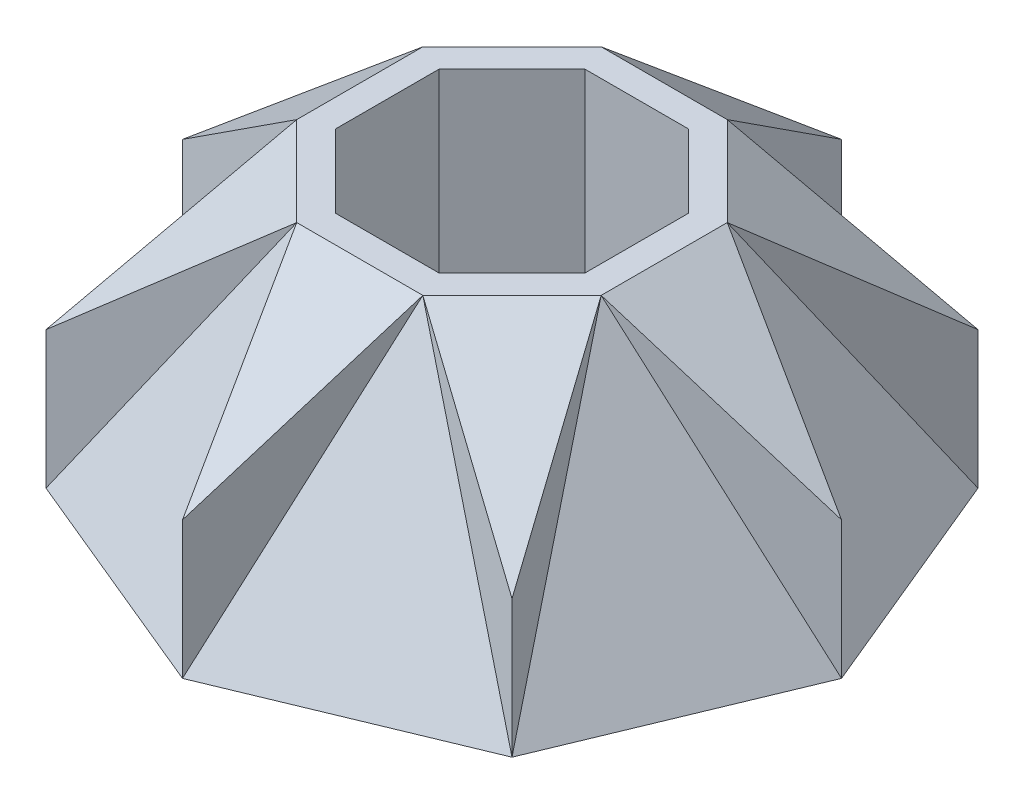
ISO-10303-21;
HEADER;
FILE_DESCRIPTION(('STEP AP214'),'2;1');
FILE_NAME('part.step','',(''),(''),'','','');
FILE_SCHEMA(('AUTOMOTIVE_DESIGN { 1 0 10303 214 1 1 1 1 }'));
ENDSEC;
DATA;
#1=APPLICATION_CONTEXT('core data for automotive mechanical design processes');
#2=APPLICATION_PROTOCOL_DEFINITION('international standard','automotive_design',2000,#1);
#3=PRODUCT_CONTEXT('',#1,'mechanical');
#4=PRODUCT('Part','Part','',(#3));
#5=PRODUCT_RELATED_PRODUCT_CATEGORY('part','',(#4));
#6=PRODUCT_DEFINITION_FORMATION('','',#4);
#7=PRODUCT_DEFINITION_CONTEXT('part definition',#1,'design');
#8=PRODUCT_DEFINITION('design','',#6,#7);
#9=PRODUCT_DEFINITION_SHAPE('','',#8);
#10=(LENGTH_UNIT() NAMED_UNIT(*) SI_UNIT(.MILLI.,.METRE.));
#11=(NAMED_UNIT(*) PLANE_ANGLE_UNIT() SI_UNIT($,.RADIAN.));
#12=(NAMED_UNIT(*) SI_UNIT($,.STERADIAN.) SOLID_ANGLE_UNIT());
#13=UNCERTAINTY_MEASURE_WITH_UNIT(LENGTH_MEASURE(1.E-05),#10,'distance_accuracy_value','');
#14=(GEOMETRIC_REPRESENTATION_CONTEXT(3) GLOBAL_UNCERTAINTY_ASSIGNED_CONTEXT((#13)) GLOBAL_UNIT_ASSIGNED_CONTEXT((#10,
#11,#12)) REPRESENTATION_CONTEXT('',''));
#15=CARTESIAN_POINT('',(0.,0.,0.));
#16=DIRECTION('',(0.,0.,1.));
#17=DIRECTION('',(1.,0.,0.));
#18=AXIS2_PLACEMENT_3D('',#15,#16,#17);
#19=CARTESIAN_POINT('',(-11.4805029709529,50.,27.7163859753386));
#20=DIRECTION('',(0.942197327088307,0.,-0.335058497620415));
#21=DIRECTION('',(-0.335058497620415,0.,-0.942197327088307));
#22=AXIS2_PLACEMENT_3D('',#19,#20,#21);
#23=PLANE('',#22);
#24=DIRECTION('',(0.270670713638564,-0.58941388352804,0.761136412663843));
#25=VECTOR('',#24,1.);
#26=CARTESIAN_POINT('',(-4.39583137593275,34.5723841260576,47.6387538231425));
#27=LINE('',#26,#25);
#28=CARTESIAN_POINT('',(-11.4805029709529,50.,27.7163859753386));
#29=VERTEX_POINT('',#28);
#30=CARTESIAN_POINT('',(-7.85181403525059E-13,25.,60.0000000000001));
#31=VERTEX_POINT('',#30);
#32=EDGE_CURVE('E57',#29,#31,#27,.T.);
#33=ORIENTED_EDGE('',*,*,#32,.F.);
#34=DIRECTION('',(-0.189404088078929,0.824894556267091,-0.532611549311417));
#35=VECTOR('',#34,1.);
#36=CARTESIAN_POINT('',(-6.05272828785892,26.3609020579179,42.9794962524054));
#37=LINE('',#36,#35);
#38=CARTESIAN_POINT('',(-7.85181403525059E-13,0.,60.0000000000001));
#39=VERTEX_POINT('',#38);
#40=EDGE_CURVE('E342',#39,#29,#37,.T.);
#41=ORIENTED_EDGE('',*,*,#40,.F.);
#42=DIRECTION('',(0.,-1.,0.));
#43=VECTOR('',#42,1.);
#44=CARTESIAN_POINT('',(-7.85181403525059E-13,50.,60.0000000000001));
#45=LINE('',#44,#43);
#46=EDGE_CURVE('E335',#31,#39,#45,.T.);
#47=ORIENTED_EDGE('',*,*,#46,.F.);
#48=EDGE_LOOP('',(#33,#41,#47));
#49=FACE_BOUND('',#48,.T.);
#50=ADVANCED_FACE('F41',(#49),#23,.F.);
#51=CARTESIAN_POINT('',(-7.85181403525059E-13,50.,60.0000000000001));
#52=DIRECTION('',(-0.942197327088295,0.,-0.335058497620448));
#53=DIRECTION('',(-0.335058497620448,0.,0.942197327088295));
#54=AXIS2_PLACEMENT_3D('',#51,#52,#53);
#55=PLANE('',#54);
#56=DIRECTION('',(-0.270670713638591,-0.589413883528038,0.761136412663835));
#57=VECTOR('',#56,1.);
#58=CARTESIAN_POINT('',(4.39583137593183,34.572384126058,47.638753823142));
#59=LINE('',#58,#57);
#60=CARTESIAN_POINT('',(11.4805029709527,50.,27.7163859753386));
#61=VERTEX_POINT('',#60);
#62=EDGE_CURVE('E281',#61,#31,#59,.T.);
#63=ORIENTED_EDGE('',*,*,#62,.T.);
#64=ORIENTED_EDGE('',*,*,#46,.T.);
#65=DIRECTION('',(-0.18940408807895,-0.824894556267086,0.532611549311418));
#66=VECTOR('',#65,1.);
#67=CARTESIAN_POINT('',(6.05272828785801,26.3609020579182,42.9794962524054));
#68=LINE('',#67,#66);
#69=EDGE_CURVE('E338',#61,#39,#68,.T.);
#70=ORIENTED_EDGE('',*,*,#69,.F.);
#71=EDGE_LOOP('',(#63,#64,#70));
#72=FACE_BOUND('',#71,.T.);
#73=ADVANCED_FACE('F493',(#72),#55,.F.);
#74=CARTESIAN_POINT('',(27.7163859753387,50.,11.4805029709526));
#75=DIRECTION('',(-0.335058497620425,0.,-0.942197327088304));
#76=DIRECTION('',(-0.942197327088304,0.,0.335058497620425));
#77=AXIS2_PLACEMENT_3D('',#74,#75,#76);
#78=PLANE('',#77);
#79=DIRECTION('',(0.761136412663841,-0.58941388352804,-0.270670713638572));
#80=VECTOR('',#79,1.);
#81=CARTESIAN_POINT('',(47.6387538231426,34.5723841260575,4.3958313759322));
#82=LINE('',#81,#80);
#83=CARTESIAN_POINT('',(27.7163859753386,50.,11.4805029709528));
#84=VERTEX_POINT('',#83);
#85=CARTESIAN_POINT('',(60.0000000000001,25.,1.56714762533294E-13));
#86=VERTEX_POINT('',#85);
#87=EDGE_CURVE('E65',#84,#86,#82,.T.);
#88=ORIENTED_EDGE('',*,*,#87,.F.);
#89=DIRECTION('',(-0.532611549311422,0.824894556267086,0.189404088078937));
#90=VECTOR('',#89,1.);
#91=CARTESIAN_POINT('',(42.9794962524054,26.3609020579183,6.05272828785848));
#92=LINE('',#91,#90);
#93=CARTESIAN_POINT('',(60.0000000000001,0.,1.56714762533294E-13));
#94=VERTEX_POINT('',#93);
#95=EDGE_CURVE('E50',#94,#84,#92,.T.);
#96=ORIENTED_EDGE('',*,*,#95,.F.);
#97=DIRECTION('',(0.,-1.,0.));
#98=VECTOR('',#97,1.);
#99=CARTESIAN_POINT('',(60.0000000000001,50.,1.56714762533294E-13));
#100=LINE('',#99,#98);
#101=EDGE_CURVE('E353',#86,#94,#100,.T.);
#102=ORIENTED_EDGE('',*,*,#101,.F.);
#103=EDGE_LOOP('',(#88,#96,#102));
#104=FACE_BOUND('',#103,.T.);
#105=ADVANCED_FACE('F516',(#104),#78,.F.);
#106=CARTESIAN_POINT('',(60.0000000000001,50.,1.56714762533294E-13));
#107=DIRECTION('',(-0.335058497620438,0.,0.942197327088299));
#108=DIRECTION('',(0.942197327088299,0.,0.335058497620438));
#109=AXIS2_PLACEMENT_3D('',#106,#107,#108);
#110=PLANE('',#109);
#111=DIRECTION('',(0.761136412663838,-0.589413883528038,0.270670713638583));
#112=VECTOR('',#111,1.);
#113=CARTESIAN_POINT('',(47.6387538231421,34.5723841260579,-4.39583137593227));
#114=LINE('',#113,#112);
#115=CARTESIAN_POINT('',(27.7163859753386,50.,-11.4805029709528));
#116=VERTEX_POINT('',#115);
#117=EDGE_CURVE('E286',#116,#86,#114,.T.);
#118=ORIENTED_EDGE('',*,*,#117,.T.);
#119=ORIENTED_EDGE('',*,*,#101,.T.);
#120=DIRECTION('',(0.532611549311418,-0.824894556267088,0.189404088078944));
#121=VECTOR('',#120,1.);
#122=CARTESIAN_POINT('',(42.9794962524054,26.360902057918,-6.05272828785846));
#123=LINE('',#122,#121);
#124=EDGE_CURVE('E356',#116,#94,#123,.T.);
#125=ORIENTED_EDGE('',*,*,#124,.F.);
#126=EDGE_LOOP('',(#118,#119,#125));
#127=FACE_BOUND('',#126,.T.);
#128=ADVANCED_FACE('F515',(#127),#110,.F.);
#129=CARTESIAN_POINT('',(11.4805029709527,50.,-27.7163859753387));
#130=DIRECTION('',(-0.942197327088305,0.,0.335058497620422));
#131=DIRECTION('',(0.335058497620422,0.,0.942197327088305));
#132=AXIS2_PLACEMENT_3D('',#129,#130,#131);
#133=PLANE('',#132);
#134=DIRECTION('',(-0.270670713638569,-0.58941388352804,-0.761136412663842));
#135=VECTOR('',#134,1.);
#136=CARTESIAN_POINT('',(4.39583137593238,34.5723841260575,-47.6387538231426));
#137=LINE('',#136,#135);
#138=CARTESIAN_POINT('',(11.4805029709527,50.,-27.7163859753386));
#139=VERTEX_POINT('',#138);
#140=CARTESIAN_POINT('',(3.66203642863882E-13,25.,-60.0000000000001));
#141=VERTEX_POINT('',#140);
#142=EDGE_CURVE('E289',#139,#141,#137,.T.);
#143=ORIENTED_EDGE('',*,*,#142,.F.);
#144=DIRECTION('',(0.189404088078933,0.82489455626709,0.532611549311418));
#145=VECTOR('',#144,1.);
#146=CARTESIAN_POINT('',(6.05272828785862,26.360902057918,-42.9794962524054));
#147=LINE('',#146,#145);
#148=CARTESIAN_POINT('',(3.66203642863882E-13,0.,-60.0000000000001));
#149=VERTEX_POINT('',#148);
#150=EDGE_CURVE('E467',#149,#139,#147,.T.);
#151=ORIENTED_EDGE('',*,*,#150,.F.);
#152=DIRECTION('',(0.,-1.,0.));
#153=VECTOR('',#152,1.);
#154=CARTESIAN_POINT('',(3.66203642863882E-13,50.,-60.0000000000001));
#155=LINE('',#154,#153);
#156=EDGE_CURVE('E367',#141,#149,#155,.T.);
#157=ORIENTED_EDGE('',*,*,#156,.F.);
#158=EDGE_LOOP('',(#143,#151,#157));
#159=FACE_BOUND('',#158,.T.);
#160=ADVANCED_FACE('F523',(#159),#133,.F.);
#161=CARTESIAN_POINT('',(3.66203642863882E-13,50.,-60.0000000000001));
#162=DIRECTION('',(0.942197327088298,0.,0.335058497620442));
#163=DIRECTION('',(0.335058497620442,0.,-0.942197327088298));
#164=AXIS2_PLACEMENT_3D('',#161,#162,#163);
#165=PLANE('',#164);
#166=DIRECTION('',(0.270670713638586,-0.589413883528038,-0.761136412663837));
#167=VECTOR('',#166,1.);
#168=CARTESIAN_POINT('',(-4.39583137593214,34.5723841260579,-47.6387538231421));
#169=LINE('',#168,#167);
#170=CARTESIAN_POINT('',(-11.4805029709527,50.,-27.7163859753386));
#171=VERTEX_POINT('',#170);
#172=EDGE_CURVE('E292',#171,#141,#169,.T.);
#173=ORIENTED_EDGE('',*,*,#172,.T.);
#174=ORIENTED_EDGE('',*,*,#156,.T.);
#175=DIRECTION('',(0.189404088078946,-0.824894556267086,-0.532611549311419));
#176=VECTOR('',#175,1.);
#177=CARTESIAN_POINT('',(-6.05272828785831,26.3609020579182,-42.9794962524054));
#178=LINE('',#177,#176);
#179=EDGE_CURVE('E370',#171,#149,#178,.T.);
#180=ORIENTED_EDGE('',*,*,#179,.F.);
#181=EDGE_LOOP('',(#173,#174,#180));
#182=FACE_BOUND('',#181,.T.);
#183=ADVANCED_FACE('F805',(#182),#165,.F.);
#184=CARTESIAN_POINT('',(-11.4805029709528,50.,-27.7163859753386));
#185=DIRECTION('',(-0.429311983438402,0.,0.903156254961557));
#186=DIRECTION('',(0.903156254961557,0.,0.429311983438402));
#187=AXIS2_PLACEMENT_3D('',#184,#185,#186);
#188=PLANE('',#187);
#189=DIRECTION('',(-0.72959781588504,-0.58941388352804,-0.346811621720169));
#190=VECTOR('',#189,1.);
#191=CARTESIAN_POINT('',(-25.6693293184032,38.5373954553154,-34.4609920702677));
#192=LINE('',#191,#190);
#193=CARTESIAN_POINT('',(-42.4264068711927,25.,-42.4264068711931));
#194=VERTEX_POINT('',#193);
#195=EDGE_CURVE('E304',#171,#194,#192,.T.);
#196=ORIENTED_EDGE('',*,*,#195,.F.);
#197=DIRECTION('',(0.510542153321447,0.824894556267088,0.242684323191309));
#198=VECTOR('',#197,1.);
#199=CARTESIAN_POINT('',(-26.1111680350332,26.3609020579182,-34.6710184690821));
#200=LINE('',#199,#198);
#201=CARTESIAN_POINT('',(-42.4264068711927,0.,-42.4264068711931));
#202=VERTEX_POINT('',#201);
#203=EDGE_CURVE('E463',#202,#171,#200,.T.);
#204=ORIENTED_EDGE('',*,*,#203,.F.);
#205=DIRECTION('',(0.,-1.,0.));
#206=VECTOR('',#205,1.);
#207=CARTESIAN_POINT('',(-42.4264068711927,50.,-42.4264068711931));
#208=LINE('',#207,#206);
#209=EDGE_CURVE('E374',#194,#202,#208,.T.);
#210=ORIENTED_EDGE('',*,*,#209,.F.);
#211=EDGE_LOOP('',(#196,#204,#210));
#212=FACE_BOUND('',#211,.T.);
#213=ADVANCED_FACE('F795',(#212),#188,.F.);
#214=CARTESIAN_POINT('',(-42.4264068711927,50.,-42.4264068711931));
#215=DIRECTION('',(0.903156254961565,0.,-0.429311983438385));
#216=DIRECTION('',(-0.429311983438385,0.,-0.903156254961565));
#217=AXIS2_PLACEMENT_3D('',#214,#215,#216);
#218=PLANE('',#217);
#219=DIRECTION('',(-0.346811621720157,-0.589413883528038,-0.729597815885047));
#220=VECTOR('',#219,1.);
#221=CARTESIAN_POINT('',(-34.4609920702672,38.537395455316,-25.6693293184027));
#222=LINE('',#221,#220);
#223=CARTESIAN_POINT('',(-27.7163859753387,50.,-11.4805029709526));
#224=VERTEX_POINT('',#223);
#225=EDGE_CURVE('E307',#224,#194,#222,.T.);
#226=ORIENTED_EDGE('',*,*,#225,.T.);
#227=ORIENTED_EDGE('',*,*,#209,.T.);
#228=DIRECTION('',(-0.242684323191301,-0.824894556267086,-0.510542153321455));
#229=VECTOR('',#228,1.);
#230=CARTESIAN_POINT('',(-34.671018469082,26.3609020579182,-26.1111680350333));
#231=LINE('',#230,#229);
#232=EDGE_CURVE('E377',#224,#202,#231,.T.);
#233=ORIENTED_EDGE('',*,*,#232,.F.);
#234=EDGE_LOOP('',(#226,#227,#233));
#235=FACE_BOUND('',#234,.T.);
#236=ADVANCED_FACE('F785',(#235),#218,.F.);
#237=CARTESIAN_POINT('',(27.7163859753387,50.,-11.4805029709527));
#238=DIRECTION('',(-0.903156254961556,0.,-0.429311983438405));
#239=DIRECTION('',(-0.429311983438405,0.,0.903156254961556));
#240=AXIS2_PLACEMENT_3D('',#237,#238,#239);
#241=PLANE('',#240);
#242=DIRECTION('',(0.346811621720172,-0.58941388352804,-0.729597815885038));
#243=VECTOR('',#242,1.);
#244=CARTESIAN_POINT('',(34.4609920702677,38.5373954553154,-25.6693293184031));
#245=LINE('',#244,#243);
#246=CARTESIAN_POINT('',(42.4264068711932,25.,-42.4264068711926));
#247=VERTEX_POINT('',#246);
#248=EDGE_CURVE('E313',#116,#247,#245,.T.);
#249=ORIENTED_EDGE('',*,*,#248,.F.);
#250=DIRECTION('',(-0.242684323191311,0.824894556267088,0.510542153321446));
#251=VECTOR('',#250,1.);
#252=CARTESIAN_POINT('',(34.6710184690822,26.3609020579182,-26.1111680350331));
#253=LINE('',#252,#251);
#254=CARTESIAN_POINT('',(42.4264068711932,0.,-42.4264068711926));
#255=VERTEX_POINT('',#254);
#256=EDGE_CURVE('E471',#255,#116,#253,.T.);
#257=ORIENTED_EDGE('',*,*,#256,.F.);
#258=DIRECTION('',(0.,-1.,0.));
#259=VECTOR('',#258,1.);
#260=CARTESIAN_POINT('',(42.4264068711932,50.,-42.4264068711926));
#261=LINE('',#260,#259);
#262=EDGE_CURVE('E360',#247,#255,#261,.T.);
#263=ORIENTED_EDGE('',*,*,#262,.F.);
#264=EDGE_LOOP('',(#249,#257,#263));
#265=FACE_BOUND('',#264,.T.);
#266=ADVANCED_FACE('F775',(#265),#241,.F.);
#267=CARTESIAN_POINT('',(42.4264068711932,50.,-42.4264068711926));
#268=DIRECTION('',(0.429311983438382,0.,0.903156254961567));
#269=DIRECTION('',(0.903156254961567,0.,-0.429311983438382));
#270=AXIS2_PLACEMENT_3D('',#267,#268,#269);
#271=PLANE('',#270);
#272=DIRECTION('',(0.729597815885048,-0.589413883528038,-0.346811621720154));
#273=VECTOR('',#272,1.);
#274=CARTESIAN_POINT('',(25.6693293184028,38.537395455316,-34.4609920702671));
#275=LINE('',#274,#273);
#276=EDGE_CURVE('E308',#139,#247,#275,.T.);
#277=ORIENTED_EDGE('',*,*,#276,.T.);
#278=ORIENTED_EDGE('',*,*,#262,.T.);
#279=DIRECTION('',(0.510542153321458,-0.824894556267084,-0.242684323191301));
#280=VECTOR('',#279,1.);
#281=CARTESIAN_POINT('',(26.1111680350335,26.3609020579183,-34.6710184690819));
#282=LINE('',#281,#280);
#283=EDGE_CURVE('E363',#139,#255,#282,.T.);
#284=ORIENTED_EDGE('',*,*,#283,.F.);
#285=EDGE_LOOP('',(#277,#278,#284));
#286=FACE_BOUND('',#285,.T.);
#287=ADVANCED_FACE('F538',(#286),#271,.F.);
#288=CARTESIAN_POINT('',(11.4805029709526,50.,27.7163859753387));
#289=DIRECTION('',(0.429311983438408,0.,-0.903156254961554));
#290=DIRECTION('',(-0.903156254961554,0.,-0.429311983438408));
#291=AXIS2_PLACEMENT_3D('',#288,#289,#290);
#292=PLANE('',#291);
#293=DIRECTION('',(0.729597815885037,-0.58941388352804,0.346811621720174));
#294=VECTOR('',#293,1.);
#295=CARTESIAN_POINT('',(25.669329318403,38.5373954553154,34.4609920702678));
#296=LINE('',#295,#294);
#297=CARTESIAN_POINT('',(42.4264068711924,25.,42.4264068711934));
#298=VERTEX_POINT('',#297);
#299=EDGE_CURVE('E303',#61,#298,#296,.T.);
#300=ORIENTED_EDGE('',*,*,#299,.F.);
#301=DIRECTION('',(-0.510542153321445,0.824894556267088,-0.242684323191313));
#302=VECTOR('',#301,1.);
#303=CARTESIAN_POINT('',(26.111168035033,26.3609020579182,34.6710184690823));
#304=LINE('',#303,#302);
#305=CARTESIAN_POINT('',(42.4264068711924,0.,42.4264068711934));
#306=VERTEX_POINT('',#305);
#307=EDGE_CURVE('E11',#306,#61,#304,.T.);
#308=ORIENTED_EDGE('',*,*,#307,.F.);
#309=DIRECTION('',(0.,-1.,0.));
#310=VECTOR('',#309,1.);
#311=CARTESIAN_POINT('',(42.4264068711924,50.,42.4264068711934));
#312=LINE('',#311,#310);
#313=EDGE_CURVE('E346',#298,#306,#312,.T.);
#314=ORIENTED_EDGE('',*,*,#313,.F.);
#315=EDGE_LOOP('',(#300,#308,#314));
#316=FACE_BOUND('',#315,.T.);
#317=ADVANCED_FACE('F535',(#316),#292,.F.);
#318=CARTESIAN_POINT('',(42.4264068711924,50.,42.4264068711934));
#319=DIRECTION('',(-0.903156254961568,0.,0.429311983438379));
#320=DIRECTION('',(0.429311983438379,0.,0.903156254961568));
#321=AXIS2_PLACEMENT_3D('',#318,#319,#320);
#322=PLANE('',#321);
#323=DIRECTION('',(0.346811621720151,-0.589413883528038,0.72959781588505));
#324=VECTOR('',#323,1.);
#325=CARTESIAN_POINT('',(34.460992070267,38.537395455316,25.6693293184029));
#326=LINE('',#325,#324);
#327=EDGE_CURVE('E316',#84,#298,#326,.T.);
#328=ORIENTED_EDGE('',*,*,#327,.T.);
#329=ORIENTED_EDGE('',*,*,#313,.T.);
#330=DIRECTION('',(0.242684323191298,-0.824894556267086,0.510542153321456));
#331=VECTOR('',#330,1.);
#332=CARTESIAN_POINT('',(34.6710184690818,26.3609020579182,26.1111680350336));
#333=LINE('',#332,#331);
#334=EDGE_CURVE('E349',#84,#306,#333,.T.);
#335=ORIENTED_EDGE('',*,*,#334,.F.);
#336=EDGE_LOOP('',(#328,#329,#335));
#337=FACE_BOUND('',#336,.T.);
#338=ADVANCED_FACE('F537',(#337),#322,.F.);
#339=CARTESIAN_POINT('',(-27.7163859753387,50.,11.4805029709525));
#340=DIRECTION('',(0.903156254961553,0.,0.429311983438411));
#341=DIRECTION('',(0.429311983438411,0.,-0.903156254961553));
#342=AXIS2_PLACEMENT_3D('',#339,#340,#341);
#343=PLANE('',#342);
#344=DIRECTION('',(-0.346811621720177,-0.58941388352804,0.729597815885036));
#345=VECTOR('',#344,1.);
#346=CARTESIAN_POINT('',(-34.4609920702679,38.5373954553154,25.6693293184029));
#347=LINE('',#346,#345);
#348=CARTESIAN_POINT('',(-27.7163859753387,50.,11.4805029709525));
#349=VERTEX_POINT('',#348);
#350=CARTESIAN_POINT('',(-42.4264068711935,25.,42.4264068711923));
#351=VERTEX_POINT('',#350);
#352=EDGE_CURVE('E296',#349,#351,#347,.T.);
#353=ORIENTED_EDGE('',*,*,#352,.F.);
#354=DIRECTION('',(0.242684323191312,0.824894556267091,-0.51054215332144));
#355=VECTOR('',#354,1.);
#356=CARTESIAN_POINT('',(-34.6710184690824,26.3609020579179,26.1111680350329));
#357=LINE('',#356,#355);
#358=CARTESIAN_POINT('',(-42.4264068711935,0.,42.4264068711923));
#359=VERTEX_POINT('',#358);
#360=EDGE_CURVE('E331',#359,#349,#357,.T.);
#361=ORIENTED_EDGE('',*,*,#360,.F.);
#362=DIRECTION('',(0.,-1.,0.));
#363=VECTOR('',#362,1.);
#364=CARTESIAN_POINT('',(-42.4264068711935,50.,42.4264068711923));
#365=LINE('',#364,#363);
#366=EDGE_CURVE('E312',#351,#359,#365,.T.);
#367=ORIENTED_EDGE('',*,*,#366,.F.);
#368=EDGE_LOOP('',(#353,#361,#367));
#369=FACE_BOUND('',#368,.T.);
#370=ADVANCED_FACE('F541',(#369),#343,.F.);
#371=CARTESIAN_POINT('',(-42.4264068711935,50.,42.4264068711923));
#372=DIRECTION('',(-0.429311983438376,0.,-0.90315625496157));
#373=DIRECTION('',(-0.90315625496157,0.,0.429311983438376));
#374=AXIS2_PLACEMENT_3D('',#371,#372,#373);
#375=PLANE('',#374);
#376=DIRECTION('',(-0.729597815885051,-0.589413883528038,0.346811621720149));
#377=VECTOR('',#376,1.);
#378=CARTESIAN_POINT('',(-25.669329318403,38.537395455316,34.4609920702669));
#379=LINE('',#378,#377);
#380=EDGE_CURVE('E299',#29,#351,#379,.T.);
#381=ORIENTED_EDGE('',*,*,#380,.T.);
#382=ORIENTED_EDGE('',*,*,#366,.T.);
#383=DIRECTION('',(-0.510542153321461,-0.824894556267083,0.242684323191298));
#384=VECTOR('',#383,1.);
#385=CARTESIAN_POINT('',(-26.1111680350337,26.3609020579185,34.6710184690817));
#386=LINE('',#385,#384);
#387=EDGE_CURVE('E327',#29,#359,#386,.T.);
#388=ORIENTED_EDGE('',*,*,#387,.F.);
#389=EDGE_LOOP('',(#381,#382,#388));
#390=FACE_BOUND('',#389,.T.);
#391=ADVANCED_FACE('F532',(#390),#375,.F.);
#392=CARTESIAN_POINT('',(-16.8528575962111,22.4004933431644,40.6863973735154));
#393=DIRECTION('',(-0.341093393395736,0.453374761196364,0.823472296371847));
#394=DIRECTION('',(0.,-0.876006947372515,0.482298484504242));
#395=AXIS2_PLACEMENT_3D('',#392,#393,#394);
#396=PLANE('',#395);
#397=ORIENTED_EDGE('',*,*,#40,.T.);
#398=ORIENTED_EDGE('',*,*,#387,.T.);
#399=DIRECTION('',(0.923879532511287,0.,0.38268343236509));
#400=VECTOR('',#399,1.);
#401=CARTESIAN_POINT('',(-21.2132034355964,0.,51.2132034355964));
#402=LINE('',#401,#400);
#403=EDGE_CURVE('E429',#359,#39,#402,.T.);
#404=ORIENTED_EDGE('',*,*,#403,.T.);
#405=EDGE_LOOP('',(#397,#398,#404));
#406=FACE_BOUND('',#405,.T.);
#407=ADVANCED_FACE('F503',(#406),#396,.T.);
#408=CARTESIAN_POINT('',(-40.6863973735154,22.4004933431644,16.8528575962111));
#409=DIRECTION('',(-0.823472296371847,0.453374761196364,0.341093393395734));
#410=DIRECTION('',(-0.341036528948945,-0.876006947372515,0.341036528948944));
#411=AXIS2_PLACEMENT_3D('',#408,#409,#410);
#412=PLANE('',#411);
#413=DIRECTION('',(0.38268343236509,0.,0.923879532511287));
#414=VECTOR('',#413,1.);
#415=CARTESIAN_POINT('',(-51.2132034355964,0.,21.2132034355964));
#416=LINE('',#415,#414);
#417=CARTESIAN_POINT('',(-60.0000000000001,0.,-1.56714762533294E-13));
#418=VERTEX_POINT('',#417);
#419=EDGE_CURVE('E391',#418,#359,#416,.T.);
#420=ORIENTED_EDGE('',*,*,#419,.T.);
#421=ORIENTED_EDGE('',*,*,#360,.T.);
#422=DIRECTION('',(-0.53261154931142,-0.824894556267086,-0.189404088078945));
#423=VECTOR('',#422,1.);
#424=CARTESIAN_POINT('',(-42.9794962524054,26.3609020579182,6.05272828785846));
#425=LINE('',#424,#423);
#426=EDGE_CURVE('E425',#349,#418,#425,.T.);
#427=ORIENTED_EDGE('',*,*,#426,.T.);
#428=EDGE_LOOP('',(#420,#421,#427));
#429=FACE_BOUND('',#428,.T.);
#430=ADVANCED_FACE('F740',(#429),#412,.T.);
#431=CARTESIAN_POINT('',(16.8528575962106,22.4004933431644,40.6863973735156));
#432=DIRECTION('',(0.341093393395726,0.453374761196364,0.823472296371851));
#433=DIRECTION('',(0.34103652894894,-0.876006947372515,0.341036528948948));
#434=AXIS2_PLACEMENT_3D('',#431,#432,#433);
#435=PLANE('',#434);
#436=ORIENTED_EDGE('',*,*,#307,.T.);
#437=ORIENTED_EDGE('',*,*,#69,.T.);
#438=DIRECTION('',(0.923879532511287,0.,-0.38268343236509));
#439=VECTOR('',#438,1.);
#440=CARTESIAN_POINT('',(21.2132034355964,0.,51.2132034355964));
#441=LINE('',#440,#439);
#442=EDGE_CURVE('E433',#39,#306,#441,.T.);
#443=ORIENTED_EDGE('',*,*,#442,.T.);
#444=EDGE_LOOP('',(#436,#437,#443));
#445=FACE_BOUND('',#444,.T.);
#446=ADVANCED_FACE('F499',(#445),#435,.T.);
#447=CARTESIAN_POINT('',(40.6863973735152,22.4004933431644,16.8528575962116));
#448=DIRECTION('',(0.823472296371843,0.453374761196364,0.341093393395744));
#449=DIRECTION('',(0.482298484504242,-0.876006947372515,0.));
#450=AXIS2_PLACEMENT_3D('',#447,#448,#449);
#451=PLANE('',#450);
#452=ORIENTED_EDGE('',*,*,#95,.T.);
#453=ORIENTED_EDGE('',*,*,#334,.T.);
#454=DIRECTION('',(0.38268343236509,0.,-0.923879532511287));
#455=VECTOR('',#454,1.);
#456=CARTESIAN_POINT('',(51.2132034355964,0.,21.2132034355964));
#457=LINE('',#456,#455);
#458=EDGE_CURVE('E437',#306,#94,#457,.T.);
#459=ORIENTED_EDGE('',*,*,#458,.T.);
#460=EDGE_LOOP('',(#452,#453,#459));
#461=FACE_BOUND('',#460,.T.);
#462=ADVANCED_FACE('F478',(#461),#451,.T.);
#463=CARTESIAN_POINT('',(40.6863973735155,22.4004933431644,-16.8528575962108));
#464=DIRECTION('',(0.82347229637185,0.453374761196364,-0.341093393395729));
#465=DIRECTION('',(0.341036528948947,-0.876006947372515,-0.341036528948941));
#466=AXIS2_PLACEMENT_3D('',#463,#464,#465);
#467=PLANE('',#466);
#468=ORIENTED_EDGE('',*,*,#256,.T.);
#469=ORIENTED_EDGE('',*,*,#124,.T.);
#470=DIRECTION('',(-0.38268343236509,0.,-0.923879532511287));
#471=VECTOR('',#470,1.);
#472=CARTESIAN_POINT('',(51.2132034355964,0.,-21.2132034355964));
#473=LINE('',#472,#471);
#474=EDGE_CURVE('E441',#94,#255,#473,.T.);
#475=ORIENTED_EDGE('',*,*,#474,.T.);
#476=EDGE_LOOP('',(#468,#469,#475));
#477=FACE_BOUND('',#476,.T.);
#478=ADVANCED_FACE('F511',(#477),#467,.T.);
#479=CARTESIAN_POINT('',(16.8528575962111,22.4004933431644,-40.6863973735154));
#480=DIRECTION('',(0.341093393395736,0.453374761196364,-0.823472296371847));
#481=DIRECTION('',(0.,-0.876006947372515,-0.482298484504242));
#482=AXIS2_PLACEMENT_3D('',#479,#480,#481);
#483=PLANE('',#482);
#484=ORIENTED_EDGE('',*,*,#150,.T.);
#485=ORIENTED_EDGE('',*,*,#283,.T.);
#486=DIRECTION('',(-0.923879532511287,0.,-0.38268343236509));
#487=VECTOR('',#486,1.);
#488=CARTESIAN_POINT('',(21.2132034355964,0.,-51.2132034355965));
#489=LINE('',#488,#487);
#490=EDGE_CURVE('E445',#255,#149,#489,.T.);
#491=ORIENTED_EDGE('',*,*,#490,.T.);
#492=EDGE_LOOP('',(#484,#485,#491));
#493=FACE_BOUND('',#492,.T.);
#494=ADVANCED_FACE('F712',(#493),#483,.T.);
#495=CARTESIAN_POINT('',(-16.8528575962109,22.4004933431644,-40.6863973735154));
#496=DIRECTION('',(-0.341093393395731,0.453374761196364,-0.823472296371848));
#497=DIRECTION('',(-0.341036528948943,-0.876006947372515,-0.341036528948946));
#498=AXIS2_PLACEMENT_3D('',#495,#496,#497);
#499=PLANE('',#498);
#500=ORIENTED_EDGE('',*,*,#203,.T.);
#501=ORIENTED_EDGE('',*,*,#179,.T.);
#502=DIRECTION('',(-0.923879532511287,0.,0.38268343236509));
#503=VECTOR('',#502,1.);
#504=CARTESIAN_POINT('',(-21.2132034355964,0.,-51.2132034355964));
#505=LINE('',#504,#503);
#506=EDGE_CURVE('E449',#149,#202,#505,.T.);
#507=ORIENTED_EDGE('',*,*,#506,.T.);
#508=EDGE_LOOP('',(#500,#501,#507));
#509=FACE_BOUND('',#508,.T.);
#510=ADVANCED_FACE('F704',(#509),#499,.T.);
#511=CARTESIAN_POINT('',(-40.6863973735153,22.4004933431644,-16.8528575962113));
#512=DIRECTION('',(-0.823472296371845,0.453374761196364,-0.341093393395739));
#513=DIRECTION('',(-0.482298484504242,-0.876006947372515,0.));
#514=AXIS2_PLACEMENT_3D('',#511,#512,#513);
#515=PLANE('',#514);
#516=DIRECTION('',(0.53261154931142,0.824894556267088,-0.189404088078936));
#517=VECTOR('',#516,1.);
#518=CARTESIAN_POINT('',(-42.9794962524054,26.3609020579182,-6.05272828785847));
#519=LINE('',#518,#517);
#520=EDGE_CURVE('E459',#418,#224,#519,.T.);
#521=ORIENTED_EDGE('',*,*,#520,.T.);
#522=ORIENTED_EDGE('',*,*,#232,.T.);
#523=DIRECTION('',(-0.38268343236509,0.,0.923879532511287));
#524=VECTOR('',#523,1.);
#525=CARTESIAN_POINT('',(-51.2132034355964,0.,-21.2132034355964));
#526=LINE('',#525,#524);
#527=EDGE_CURVE('E397',#202,#418,#526,.T.);
#528=ORIENTED_EDGE('',*,*,#527,.T.);
#529=EDGE_LOOP('',(#521,#522,#528));
#530=FACE_BOUND('',#529,.T.);
#531=ADVANCED_FACE('F696',(#530),#515,.T.);
#532=CARTESIAN_POINT('',(-27.7163859753387,50.,-11.4805029709526));
#533=DIRECTION('',(0.335058497620425,0.,0.942197327088304));
#534=DIRECTION('',(0.942197327088304,0.,-0.335058497620425));
#535=AXIS2_PLACEMENT_3D('',#532,#533,#534);
#536=PLANE('',#535);
#537=DIRECTION('',(-0.761136412663841,-0.58941388352804,0.270670713638572));
#538=VECTOR('',#537,1.);
#539=CARTESIAN_POINT('',(-47.6387538231426,34.5723841260575,-4.3958313759322));
#540=LINE('',#539,#538);
#541=CARTESIAN_POINT('',(-60.0000000000001,25.,-1.56714762533294E-13));
#542=VERTEX_POINT('',#541);
#543=EDGE_CURVE('E381',#224,#542,#540,.T.);
#544=ORIENTED_EDGE('',*,*,#543,.F.);
#545=ORIENTED_EDGE('',*,*,#520,.F.);
#546=DIRECTION('',(0.,-1.,0.));
#547=VECTOR('',#546,1.);
#548=CARTESIAN_POINT('',(-60.0000000000001,50.,-1.56714762533294E-13));
#549=LINE('',#548,#547);
#550=EDGE_CURVE('E388',#542,#418,#549,.T.);
#551=ORIENTED_EDGE('',*,*,#550,.F.);
#552=EDGE_LOOP('',(#544,#545,#551));
#553=FACE_BOUND('',#552,.T.);
#554=ADVANCED_FACE('F688',(#553),#536,.F.);
#555=CARTESIAN_POINT('',(-60.0000000000001,50.,-1.56714762533294E-13));
#556=DIRECTION('',(0.335058497620438,0.,-0.942197327088299));
#557=DIRECTION('',(-0.942197327088299,0.,-0.335058497620438));
#558=AXIS2_PLACEMENT_3D('',#555,#556,#557);
#559=PLANE('',#558);
#560=DIRECTION('',(-0.761136412663838,-0.589413883528038,-0.270670713638583));
#561=VECTOR('',#560,1.);
#562=CARTESIAN_POINT('',(-47.6387538231421,34.5723841260579,4.39583137593227));
#563=LINE('',#562,#561);
#564=EDGE_CURVE('E384',#349,#542,#563,.T.);
#565=ORIENTED_EDGE('',*,*,#564,.T.);
#566=ORIENTED_EDGE('',*,*,#550,.T.);
#567=ORIENTED_EDGE('',*,*,#426,.F.);
#568=EDGE_LOOP('',(#565,#566,#567));
#569=FACE_BOUND('',#568,.T.);
#570=ADVANCED_FACE('F682',(#569),#559,.F.);
#571=CARTESIAN_POINT('',(0.,0.,0.));
#572=DIRECTION('',(0.,1.,0.));
#573=DIRECTION('',(0.,0.,1.));
#574=AXIS2_PLACEMENT_3D('',#571,#572,#573);
#575=PLANE('',#574);
#576=ORIENTED_EDGE('',*,*,#403,.F.);
#577=ORIENTED_EDGE('',*,*,#419,.F.);
#578=ORIENTED_EDGE('',*,*,#527,.F.);
#579=ORIENTED_EDGE('',*,*,#506,.F.);
#580=ORIENTED_EDGE('',*,*,#490,.F.);
#581=ORIENTED_EDGE('',*,*,#474,.F.);
#582=ORIENTED_EDGE('',*,*,#458,.F.);
#583=ORIENTED_EDGE('',*,*,#442,.F.);
#584=EDGE_LOOP('',(#576,#577,#578,#579,#580,#581,#582,#583));
#585=FACE_BOUND('',#584,.T.);
#586=DIRECTION('',(-1.,0.,0.));
#587=VECTOR('',#586,1.);
#588=CARTESIAN_POINT('',(0.,0.,-22.7163859753386));
#589=LINE('',#588,#587);
#590=CARTESIAN_POINT('',(9.4094351590872,0.,-22.7163859753386));
#591=VERTEX_POINT('',#590);
#592=CARTESIAN_POINT('',(-9.40943515908722,0.,-22.7163859753386));
#593=VERTEX_POINT('',#592);
#594=EDGE_CURVE('E185',#591,#593,#589,.T.);
#595=ORIENTED_EDGE('',*,*,#594,.T.);
#596=DIRECTION('',(-0.707106781186548,0.,0.707106781186548));
#597=VECTOR('',#596,1.);
#598=CARTESIAN_POINT('',(-16.0629105672129,0.,-16.0629105672129));
#599=LINE('',#598,#597);
#600=CARTESIAN_POINT('',(-22.7163859753386,0.,-9.40943515908722));
#601=VERTEX_POINT('',#600);
#602=EDGE_CURVE('E204',#593,#601,#599,.T.);
#603=ORIENTED_EDGE('',*,*,#602,.T.);
#604=DIRECTION('',(0.,0.,1.));
#605=VECTOR('',#604,1.);
#606=CARTESIAN_POINT('',(-22.7163859753386,0.,0.));
#607=LINE('',#606,#605);
#608=CARTESIAN_POINT('',(-22.7163859753386,0.,9.40943515908724));
#609=VERTEX_POINT('',#608);
#610=EDGE_CURVE('E253',#601,#609,#607,.T.);
#611=ORIENTED_EDGE('',*,*,#610,.T.);
#612=DIRECTION('',(0.707106781186548,0.,0.707106781186548));
#613=VECTOR('',#612,1.);
#614=CARTESIAN_POINT('',(-16.0629105672129,0.,16.0629105672129));
#615=LINE('',#614,#613);
#616=CARTESIAN_POINT('',(-9.40943515908723,0.,22.7163859753386));
#617=VERTEX_POINT('',#616);
#618=EDGE_CURVE('E249',#609,#617,#615,.T.);
#619=ORIENTED_EDGE('',*,*,#618,.T.);
#620=DIRECTION('',(1.,0.,0.));
#621=VECTOR('',#620,1.);
#622=CARTESIAN_POINT('',(0.,0.,22.7163859753386));
#623=LINE('',#622,#621);
#624=CARTESIAN_POINT('',(9.40943515908722,0.,22.7163859753386));
#625=VERTEX_POINT('',#624);
#626=EDGE_CURVE('E245',#617,#625,#623,.T.);
#627=ORIENTED_EDGE('',*,*,#626,.T.);
#628=DIRECTION('',(0.707106781186548,0.,-0.707106781186548));
#629=VECTOR('',#628,1.);
#630=CARTESIAN_POINT('',(16.0629105672129,0.,16.0629105672129));
#631=LINE('',#630,#629);
#632=CARTESIAN_POINT('',(22.7163859753386,0.,9.40943515908723));
#633=VERTEX_POINT('',#632);
#634=EDGE_CURVE('E241',#625,#633,#631,.T.);
#635=ORIENTED_EDGE('',*,*,#634,.T.);
#636=DIRECTION('',(0.,0.,-1.));
#637=VECTOR('',#636,1.);
#638=CARTESIAN_POINT('',(22.7163859753386,0.,0.));
#639=LINE('',#638,#637);
#640=CARTESIAN_POINT('',(22.7163859753386,0.,-9.4094351590872));
#641=VERTEX_POINT('',#640);
#642=EDGE_CURVE('E237',#633,#641,#639,.T.);
#643=ORIENTED_EDGE('',*,*,#642,.T.);
#644=DIRECTION('',(-0.707106781186548,0.,-0.707106781186548));
#645=VECTOR('',#644,1.);
#646=CARTESIAN_POINT('',(16.0629105672129,0.,-16.0629105672129));
#647=LINE('',#646,#645);
#648=EDGE_CURVE('E234',#641,#591,#647,.T.);
#649=ORIENTED_EDGE('',*,*,#648,.T.);
#650=EDGE_LOOP('',(#595,#603,#611,#619,#627,#635,#643,#649));
#651=FACE_BOUND('',#650,.T.);
#652=ADVANCED_FACE('F43',(#585,#651),#575,.F.);
#653=CARTESIAN_POINT('',(-60.0000000000001,25.,60.001));
#654=DIRECTION('',(-0.612268652496693,0.790649794264113,0.));
#655=DIRECTION('',(-0.790649794264113,-0.612268652496693,0.));
#656=AXIS2_PLACEMENT_3D('',#653,#654,#655);
#657=PLANE('',#656);
#658=DIRECTION('',(0.,0.,1.));
#659=VECTOR('',#658,1.);
#660=CARTESIAN_POINT('',(-27.7163859753386,50.,0.));
#661=LINE('',#660,#659);
#662=EDGE_CURVE('E401',#224,#349,#661,.T.);
#663=ORIENTED_EDGE('',*,*,#662,.F.);
#664=ORIENTED_EDGE('',*,*,#543,.T.);
#665=ORIENTED_EDGE('',*,*,#564,.F.);
#666=EDGE_LOOP('',(#663,#664,#665));
#667=FACE_BOUND('',#666,.T.);
#668=ADVANCED_FACE('F568',(#667),#657,.T.);
#669=CARTESIAN_POINT('',(17.5745931288059,25.,102.427406871193));
#670=DIRECTION('',(-0.432939316088367,0.790649794264113,0.432939316088356));
#671=DIRECTION('',(-0.877112891620865,-0.480284265151883,0.));
#672=AXIS2_PLACEMENT_3D('',#669,#670,#671);
#673=PLANE('',#672);
#674=DIRECTION('',(0.707106781186548,0.,0.707106781186548));
#675=VECTOR('',#674,1.);
#676=CARTESIAN_POINT('',(-19.5984444731457,50.,19.5984444731457));
#677=LINE('',#676,#675);
#678=EDGE_CURVE('E396',#349,#29,#677,.T.);
#679=ORIENTED_EDGE('',*,*,#678,.F.);
#680=ORIENTED_EDGE('',*,*,#352,.T.);
#681=ORIENTED_EDGE('',*,*,#380,.F.);
#682=EDGE_LOOP('',(#679,#680,#681));
#683=FACE_BOUND('',#682,.T.);
#684=ADVANCED_FACE('F557',(#683),#673,.T.);
#685=CARTESIAN_POINT('',(102.427406871193,25.,-17.5745931288063));
#686=DIRECTION('',(0.432939316088358,0.790649794264113,0.432939316088365));
#687=DIRECTION('',(0.,-0.480284265151882,0.877112891620866));
#688=AXIS2_PLACEMENT_3D('',#685,#686,#687);
#689=PLANE('',#688);
#690=DIRECTION('',(0.707106781186548,0.,-0.707106781186548));
#691=VECTOR('',#690,1.);
#692=CARTESIAN_POINT('',(19.5984444731456,50.,19.5984444731456));
#693=LINE('',#692,#691);
#694=EDGE_CURVE('E421',#61,#84,#693,.T.);
#695=ORIENTED_EDGE('',*,*,#694,.F.);
#696=ORIENTED_EDGE('',*,*,#299,.T.);
#697=ORIENTED_EDGE('',*,*,#327,.F.);
#698=EDGE_LOOP('',(#695,#696,#697));
#699=FACE_BOUND('',#698,.T.);
#700=ADVANCED_FACE('F487',(#699),#689,.T.);
#701=CARTESIAN_POINT('',(-17.5745931288066,25.,-102.427406871193));
#702=DIRECTION('',(0.432939316088364,0.790649794264113,-0.432939316088359));
#703=DIRECTION('',(-0.877112891620866,0.480284265151881,0.));
#704=AXIS2_PLACEMENT_3D('',#701,#702,#703);
#705=PLANE('',#704);
#706=DIRECTION('',(-0.707106781186548,0.,-0.707106781186547));
#707=VECTOR('',#706,1.);
#708=CARTESIAN_POINT('',(19.5984444731456,50.,-19.5984444731456));
#709=LINE('',#708,#707);
#710=EDGE_CURVE('E413',#116,#139,#709,.T.);
#711=ORIENTED_EDGE('',*,*,#710,.F.);
#712=ORIENTED_EDGE('',*,*,#248,.T.);
#713=ORIENTED_EDGE('',*,*,#276,.F.);
#714=EDGE_LOOP('',(#711,#712,#713));
#715=FACE_BOUND('',#714,.T.);
#716=ADVANCED_FACE('F556',(#715),#705,.T.);
#717=CARTESIAN_POINT('',(-102.427406871193,25.,17.574593128807));
#718=DIRECTION('',(-0.432939316088361,0.790649794264113,-0.432939316088362));
#719=DIRECTION('',(0.,0.480284265151879,0.877112891620867));
#720=AXIS2_PLACEMENT_3D('',#717,#718,#719);
#721=PLANE('',#720);
#722=DIRECTION('',(-0.707106781186547,0.,0.707106781186548));
#723=VECTOR('',#722,1.);
#724=CARTESIAN_POINT('',(-19.5984444731457,50.,-19.5984444731456));
#725=LINE('',#724,#723);
#726=EDGE_CURVE('E405',#171,#224,#725,.T.);
#727=ORIENTED_EDGE('',*,*,#726,.F.);
#728=ORIENTED_EDGE('',*,*,#195,.T.);
#729=ORIENTED_EDGE('',*,*,#225,.F.);
#730=EDGE_LOOP('',(#727,#728,#729));
#731=FACE_BOUND('',#730,.T.);
#732=ADVANCED_FACE('F560',(#731),#721,.T.);
#733=CARTESIAN_POINT('',(-60.0010000000001,25.,-60.0000000000003));
#734=DIRECTION('',(0.,0.790649794264113,-0.612268652496693));
#735=DIRECTION('',(0.,0.612268652496693,0.790649794264113));
#736=AXIS2_PLACEMENT_3D('',#733,#734,#735);
#737=PLANE('',#736);
#738=DIRECTION('',(-1.,0.,0.));
#739=VECTOR('',#738,1.);
#740=CARTESIAN_POINT('',(0.,50.,-27.7163859753386));
#741=LINE('',#740,#739);
#742=EDGE_CURVE('E409',#139,#171,#741,.T.);
#743=ORIENTED_EDGE('',*,*,#742,.F.);
#744=ORIENTED_EDGE('',*,*,#142,.T.);
#745=ORIENTED_EDGE('',*,*,#172,.F.);
#746=EDGE_LOOP('',(#743,#744,#745));
#747=FACE_BOUND('',#746,.T.);
#748=ADVANCED_FACE('F564',(#747),#737,.T.);
#749=CARTESIAN_POINT('',(60.0000000000001,25.,-60.0010000000001));
#750=DIRECTION('',(0.612268652496693,0.790649794264113,0.));
#751=DIRECTION('',(-0.790649794264113,0.612268652496693,0.));
#752=AXIS2_PLACEMENT_3D('',#749,#750,#751);
#753=PLANE('',#752);
#754=DIRECTION('',(0.,0.,-1.));
#755=VECTOR('',#754,1.);
#756=CARTESIAN_POINT('',(27.7163859753386,50.,0.));
#757=LINE('',#756,#755);
#758=EDGE_CURVE('E417',#84,#116,#757,.T.);
#759=ORIENTED_EDGE('',*,*,#758,.F.);
#760=ORIENTED_EDGE('',*,*,#87,.T.);
#761=ORIENTED_EDGE('',*,*,#117,.F.);
#762=EDGE_LOOP('',(#759,#760,#761));
#763=FACE_BOUND('',#762,.T.);
#764=ADVANCED_FACE('F572',(#763),#753,.T.);
#765=CARTESIAN_POINT('',(60.0010000000001,25.,60.0000000000007));
#766=DIRECTION('',(0.,0.790649794264113,0.612268652496693));
#767=DIRECTION('',(0.,-0.612268652496693,0.790649794264113));
#768=AXIS2_PLACEMENT_3D('',#765,#766,#767);
#769=PLANE('',#768);
#770=DIRECTION('',(1.,0.,0.));
#771=VECTOR('',#770,1.);
#772=CARTESIAN_POINT('',(0.,50.,27.7163859753386));
#773=LINE('',#772,#771);
#774=EDGE_CURVE('E392',#29,#61,#773,.T.);
#775=ORIENTED_EDGE('',*,*,#774,.F.);
#776=ORIENTED_EDGE('',*,*,#32,.T.);
#777=ORIENTED_EDGE('',*,*,#62,.F.);
#778=EDGE_LOOP('',(#775,#776,#777));
#779=FACE_BOUND('',#778,.T.);
#780=ADVANCED_FACE('F489',(#779),#769,.T.);
#781=CARTESIAN_POINT('',(0.,50.,-22.7163859753386));
#782=DIRECTION('',(0.,0.,1.));
#783=DIRECTION('',(1.,0.,0.));
#784=AXIS2_PLACEMENT_3D('',#781,#782,#783);
#785=PLANE('',#784);
#786=ORIENTED_EDGE('',*,*,#594,.F.);
#787=DIRECTION('',(0.,-1.,0.));
#788=VECTOR('',#787,1.);
#789=CARTESIAN_POINT('',(9.4094351590872,50.,-22.7163859753386));
#790=LINE('',#789,#788);
#791=CARTESIAN_POINT('',(9.4094351590872,50.,-22.7163859753386));
#792=VERTEX_POINT('',#791);
#793=EDGE_CURVE('E179',#792,#591,#790,.T.);
#794=ORIENTED_EDGE('',*,*,#793,.F.);
#795=DIRECTION('',(-1.,0.,0.));
#796=VECTOR('',#795,1.);
#797=CARTESIAN_POINT('',(0.,50.,-22.7163859753386));
#798=LINE('',#797,#796);
#799=CARTESIAN_POINT('',(-9.40943515908722,50.,-22.7163859753386));
#800=VERTEX_POINT('',#799);
#801=EDGE_CURVE('E182',#792,#800,#798,.T.);
#802=ORIENTED_EDGE('',*,*,#801,.T.);
#803=DIRECTION('',(0.,-1.,0.));
#804=VECTOR('',#803,1.);
#805=CARTESIAN_POINT('',(-9.40943515908722,50.,-22.7163859753386));
#806=LINE('',#805,#804);
#807=EDGE_CURVE('E231',#800,#593,#806,.T.);
#808=ORIENTED_EDGE('',*,*,#807,.T.);
#809=EDGE_LOOP('',(#786,#794,#802,#808));
#810=FACE_BOUND('',#809,.T.);
#811=ADVANCED_FACE('F181',(#810),#785,.T.);
#812=CARTESIAN_POINT('',(16.0629105672129,50.,-16.0629105672129));
#813=DIRECTION('',(-0.707106781186548,0.,0.707106781186548));
#814=DIRECTION('',(0.707106781186548,0.,0.707106781186548));
#815=AXIS2_PLACEMENT_3D('',#812,#813,#814);
#816=PLANE('',#815);
#817=ORIENTED_EDGE('',*,*,#648,.F.);
#818=DIRECTION('',(0.,-1.,0.));
#819=VECTOR('',#818,1.);
#820=CARTESIAN_POINT('',(22.7163859753386,50.,-9.4094351590872));
#821=LINE('',#820,#819);
#822=CARTESIAN_POINT('',(22.7163859753386,50.,-9.4094351590872));
#823=VERTEX_POINT('',#822);
#824=EDGE_CURVE('E191',#823,#641,#821,.T.);
#825=ORIENTED_EDGE('',*,*,#824,.F.);
#826=DIRECTION('',(-0.707106781186548,0.,-0.707106781186548));
#827=VECTOR('',#826,1.);
#828=CARTESIAN_POINT('',(16.0629105672129,50.,-16.0629105672129));
#829=LINE('',#828,#827);
#830=EDGE_CURVE('E198',#823,#792,#829,.T.);
#831=ORIENTED_EDGE('',*,*,#830,.T.);
#832=ORIENTED_EDGE('',*,*,#793,.T.);
#833=EDGE_LOOP('',(#817,#825,#831,#832));
#834=FACE_BOUND('',#833,.T.);
#835=ADVANCED_FACE('F206',(#834),#816,.T.);
#836=CARTESIAN_POINT('',(22.7163859753386,50.,0.));
#837=DIRECTION('',(-1.,0.,0.));
#838=DIRECTION('',(0.,0.,1.));
#839=AXIS2_PLACEMENT_3D('',#836,#837,#838);
#840=PLANE('',#839);
#841=ORIENTED_EDGE('',*,*,#642,.F.);
#842=DIRECTION('',(0.,-1.,0.));
#843=VECTOR('',#842,1.);
#844=CARTESIAN_POINT('',(22.7163859753386,50.,9.40943515908723));
#845=LINE('',#844,#843);
#846=CARTESIAN_POINT('',(22.7163859753386,50.,9.40943515908723));
#847=VERTEX_POINT('',#846);
#848=EDGE_CURVE('E274',#847,#633,#845,.T.);
#849=ORIENTED_EDGE('',*,*,#848,.F.);
#850=DIRECTION('',(0.,0.,-1.));
#851=VECTOR('',#850,1.);
#852=CARTESIAN_POINT('',(22.7163859753386,50.,0.));
#853=LINE('',#852,#851);
#854=EDGE_CURVE('E208',#847,#823,#853,.T.);
#855=ORIENTED_EDGE('',*,*,#854,.T.);
#856=ORIENTED_EDGE('',*,*,#824,.T.);
#857=EDGE_LOOP('',(#841,#849,#855,#856));
#858=FACE_BOUND('',#857,.T.);
#859=ADVANCED_FACE('F582',(#858),#840,.T.);
#860=CARTESIAN_POINT('',(16.0629105672129,50.,16.0629105672129));
#861=DIRECTION('',(-0.707106781186548,0.,-0.707106781186548));
#862=DIRECTION('',(-0.707106781186548,0.,0.707106781186548));
#863=AXIS2_PLACEMENT_3D('',#860,#861,#862);
#864=PLANE('',#863);
#865=ORIENTED_EDGE('',*,*,#634,.F.);
#866=DIRECTION('',(0.,-1.,0.));
#867=VECTOR('',#866,1.);
#868=CARTESIAN_POINT('',(9.40943515908722,50.,22.7163859753386));
#869=LINE('',#868,#867);
#870=CARTESIAN_POINT('',(9.40943515908722,50.,22.7163859753386));
#871=VERTEX_POINT('',#870);
#872=EDGE_CURVE('E271',#871,#625,#869,.T.);
#873=ORIENTED_EDGE('',*,*,#872,.F.);
#874=DIRECTION('',(0.707106781186548,0.,-0.707106781186548));
#875=VECTOR('',#874,1.);
#876=CARTESIAN_POINT('',(16.0629105672129,50.,16.0629105672129));
#877=LINE('',#876,#875);
#878=EDGE_CURVE('E211',#871,#847,#877,.T.);
#879=ORIENTED_EDGE('',*,*,#878,.T.);
#880=ORIENTED_EDGE('',*,*,#848,.T.);
#881=EDGE_LOOP('',(#865,#873,#879,#880));
#882=FACE_BOUND('',#881,.T.);
#883=ADVANCED_FACE('F585',(#882),#864,.T.);
#884=CARTESIAN_POINT('',(0.,50.,22.7163859753386));
#885=DIRECTION('',(0.,0.,-1.));
#886=DIRECTION('',(-1.,0.,0.));
#887=AXIS2_PLACEMENT_3D('',#884,#885,#886);
#888=PLANE('',#887);
#889=ORIENTED_EDGE('',*,*,#626,.F.);
#890=DIRECTION('',(0.,-1.,0.));
#891=VECTOR('',#890,1.);
#892=CARTESIAN_POINT('',(-9.40943515908723,50.,22.7163859753386));
#893=LINE('',#892,#891);
#894=CARTESIAN_POINT('',(-9.40943515908723,50.,22.7163859753386));
#895=VERTEX_POINT('',#894);
#896=EDGE_CURVE('E268',#895,#617,#893,.T.);
#897=ORIENTED_EDGE('',*,*,#896,.F.);
#898=DIRECTION('',(1.,0.,0.));
#899=VECTOR('',#898,1.);
#900=CARTESIAN_POINT('',(0.,50.,22.7163859753386));
#901=LINE('',#900,#899);
#902=EDGE_CURVE('E217',#895,#871,#901,.T.);
#903=ORIENTED_EDGE('',*,*,#902,.T.);
#904=ORIENTED_EDGE('',*,*,#872,.T.);
#905=EDGE_LOOP('',(#889,#897,#903,#904));
#906=FACE_BOUND('',#905,.T.);
#907=ADVANCED_FACE('F589',(#906),#888,.T.);
#908=CARTESIAN_POINT('',(-16.0629105672129,50.,16.0629105672129));
#909=DIRECTION('',(0.707106781186548,0.,-0.707106781186548));
#910=DIRECTION('',(-0.707106781186548,0.,-0.707106781186548));
#911=AXIS2_PLACEMENT_3D('',#908,#909,#910);
#912=PLANE('',#911);
#913=ORIENTED_EDGE('',*,*,#618,.F.);
#914=DIRECTION('',(0.,-1.,0.));
#915=VECTOR('',#914,1.);
#916=CARTESIAN_POINT('',(-22.7163859753386,50.,9.40943515908724));
#917=LINE('',#916,#915);
#918=CARTESIAN_POINT('',(-22.7163859753386,50.,9.40943515908724));
#919=VERTEX_POINT('',#918);
#920=EDGE_CURVE('E265',#919,#609,#917,.T.);
#921=ORIENTED_EDGE('',*,*,#920,.F.);
#922=DIRECTION('',(0.707106781186548,0.,0.707106781186548));
#923=VECTOR('',#922,1.);
#924=CARTESIAN_POINT('',(-16.0629105672129,50.,16.0629105672129));
#925=LINE('',#924,#923);
#926=EDGE_CURVE('E221',#919,#895,#925,.T.);
#927=ORIENTED_EDGE('',*,*,#926,.T.);
#928=ORIENTED_EDGE('',*,*,#896,.T.);
#929=EDGE_LOOP('',(#913,#921,#927,#928));
#930=FACE_BOUND('',#929,.T.);
#931=ADVANCED_FACE('F593',(#930),#912,.T.);
#932=CARTESIAN_POINT('',(-22.7163859753386,50.,0.));
#933=DIRECTION('',(1.,0.,0.));
#934=DIRECTION('',(0.,0.,-1.));
#935=AXIS2_PLACEMENT_3D('',#932,#933,#934);
#936=PLANE('',#935);
#937=ORIENTED_EDGE('',*,*,#610,.F.);
#938=DIRECTION('',(0.,-1.,0.));
#939=VECTOR('',#938,1.);
#940=CARTESIAN_POINT('',(-22.7163859753386,50.,-9.40943515908722));
#941=LINE('',#940,#939);
#942=CARTESIAN_POINT('',(-22.7163859753386,50.,-9.40943515908722));
#943=VERTEX_POINT('',#942);
#944=EDGE_CURVE('E262',#943,#601,#941,.T.);
#945=ORIENTED_EDGE('',*,*,#944,.F.);
#946=DIRECTION('',(0.,0.,1.));
#947=VECTOR('',#946,1.);
#948=CARTESIAN_POINT('',(-22.7163859753386,50.,0.));
#949=LINE('',#948,#947);
#950=EDGE_CURVE('E225',#943,#919,#949,.T.);
#951=ORIENTED_EDGE('',*,*,#950,.T.);
#952=ORIENTED_EDGE('',*,*,#920,.T.);
#953=EDGE_LOOP('',(#937,#945,#951,#952));
#954=FACE_BOUND('',#953,.T.);
#955=ADVANCED_FACE('F597',(#954),#936,.T.);
#956=CARTESIAN_POINT('',(-16.0629105672129,50.,-16.0629105672129));
#957=DIRECTION('',(0.707106781186548,0.,0.707106781186548));
#958=DIRECTION('',(0.707106781186548,0.,-0.707106781186548));
#959=AXIS2_PLACEMENT_3D('',#956,#957,#958);
#960=PLANE('',#959);
#961=ORIENTED_EDGE('',*,*,#602,.F.);
#962=ORIENTED_EDGE('',*,*,#807,.F.);
#963=DIRECTION('',(-0.707106781186548,0.,0.707106781186548));
#964=VECTOR('',#963,1.);
#965=CARTESIAN_POINT('',(-16.0629105672129,50.,-16.0629105672129));
#966=LINE('',#965,#964);
#967=EDGE_CURVE('E202',#800,#943,#966,.T.);
#968=ORIENTED_EDGE('',*,*,#967,.T.);
#969=ORIENTED_EDGE('',*,*,#944,.T.);
#970=EDGE_LOOP('',(#961,#962,#968,#969));
#971=FACE_BOUND('',#970,.T.);
#972=ADVANCED_FACE('F601',(#971),#960,.T.);
#973=CARTESIAN_POINT('',(0.,50.,0.));
#974=DIRECTION('',(0.,1.,0.));
#975=DIRECTION('',(0.,0.,1.));
#976=AXIS2_PLACEMENT_3D('',#973,#974,#975);
#977=PLANE('',#976);
#978=ORIENTED_EDGE('',*,*,#801,.F.);
#979=ORIENTED_EDGE('',*,*,#830,.F.);
#980=ORIENTED_EDGE('',*,*,#854,.F.);
#981=ORIENTED_EDGE('',*,*,#878,.F.);
#982=ORIENTED_EDGE('',*,*,#902,.F.);
#983=ORIENTED_EDGE('',*,*,#926,.F.);
#984=ORIENTED_EDGE('',*,*,#950,.F.);
#985=ORIENTED_EDGE('',*,*,#967,.F.);
#986=EDGE_LOOP('',(#978,#979,#980,#981,#982,#983,#984,#985));
#987=FACE_BOUND('',#986,.T.);
#988=ORIENTED_EDGE('',*,*,#678,.T.);
#989=ORIENTED_EDGE('',*,*,#774,.T.);
#990=ORIENTED_EDGE('',*,*,#694,.T.);
#991=ORIENTED_EDGE('',*,*,#758,.T.);
#992=ORIENTED_EDGE('',*,*,#710,.T.);
#993=ORIENTED_EDGE('',*,*,#742,.T.);
#994=ORIENTED_EDGE('',*,*,#726,.T.);
#995=ORIENTED_EDGE('',*,*,#662,.T.);
#996=EDGE_LOOP('',(#988,#989,#990,#991,#992,#993,#994,#995));
#997=FACE_BOUND('',#996,.T.);
#998=ADVANCED_FACE('F195',(#987,#997),#977,.T.);
#999=CLOSED_SHELL('',(#50,#73,#105,#128,#160,#183,#213,#236,#266,#287,#317,#338,#370,#391,#407,
#430,#446,#462,#478,#494,#510,#531,#554,#570,#652,#668,#684,#700,#716,#732,#748,#764,#780,#811,
#835,#859,#883,#907,#931,#955,#972,#998));
#1000=MANIFOLD_SOLID_BREP('B2',#999);
#1001=ADVANCED_BREP_SHAPE_REPRESENTATION('',(#18,#1000),#14);
#1002=SHAPE_DEFINITION_REPRESENTATION(#9,#1001);
ENDSEC;
END-ISO-10303-21;
